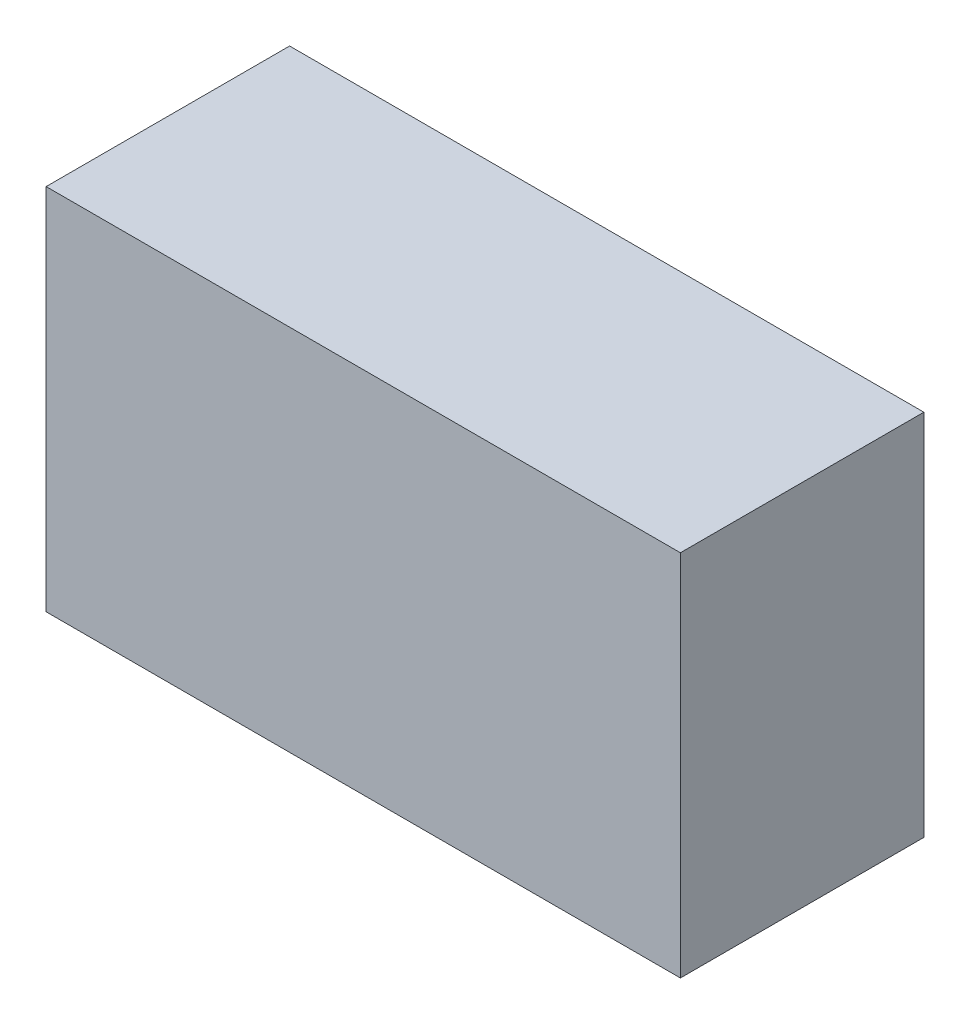
ISO-10303-21;
HEADER;
FILE_DESCRIPTION(('STEP AP214'),'2;1');
FILE_NAME('part.step','',(''),(''),'','','');
FILE_SCHEMA(('AUTOMOTIVE_DESIGN { 1 0 10303 214 1 1 1 1 }'));
ENDSEC;
DATA;
#1=APPLICATION_CONTEXT('core data for automotive mechanical design processes');
#2=APPLICATION_PROTOCOL_DEFINITION('international standard','automotive_design',2000,#1);
#3=PRODUCT_CONTEXT('',#1,'mechanical');
#4=PRODUCT('Part','Part','',(#3));
#5=PRODUCT_RELATED_PRODUCT_CATEGORY('part','',(#4));
#6=PRODUCT_DEFINITION_FORMATION('','',#4);
#7=PRODUCT_DEFINITION_CONTEXT('part definition',#1,'design');
#8=PRODUCT_DEFINITION('design','',#6,#7);
#9=PRODUCT_DEFINITION_SHAPE('','',#8);
#10=(LENGTH_UNIT() NAMED_UNIT(*) SI_UNIT(.MILLI.,.METRE.));
#11=(NAMED_UNIT(*) PLANE_ANGLE_UNIT() SI_UNIT($,.RADIAN.));
#12=(NAMED_UNIT(*) SI_UNIT($,.STERADIAN.) SOLID_ANGLE_UNIT());
#13=UNCERTAINTY_MEASURE_WITH_UNIT(LENGTH_MEASURE(1.E-05),#10,'distance_accuracy_value','');
#14=(GEOMETRIC_REPRESENTATION_CONTEXT(3) GLOBAL_UNCERTAINTY_ASSIGNED_CONTEXT((#13)) GLOBAL_UNIT_ASSIGNED_CONTEXT((#10,
#11,#12)) REPRESENTATION_CONTEXT('',''));
#15=CARTESIAN_POINT('',(0.,0.,0.));
#16=DIRECTION('',(0.,0.,1.));
#17=DIRECTION('',(1.,0.,0.));
#18=AXIS2_PLACEMENT_3D('',#15,#16,#17);
#19=CARTESIAN_POINT('',(-1.54999944,-0.90000074,1.19000016));
#20=DIRECTION('',(0.,0.,1.));
#21=DIRECTION('',(1.,0.,0.));
#22=AXIS2_PLACEMENT_3D('',#19,#20,#21);
#23=PLANE('',#22);
#24=DIRECTION('',(1.,0.,0.));
#25=VECTOR('',#24,1.);
#26=CARTESIAN_POINT('',(-1.54999944,0.90000074,1.19000016));
#27=LINE('',#26,#25);
#28=CARTESIAN_POINT('',(-1.54999944,0.90000074,1.19000016));
#29=VERTEX_POINT('',#28);
#30=CARTESIAN_POINT('',(1.54999944,0.90000074,1.19000016));
#31=VERTEX_POINT('',#30);
#32=EDGE_CURVE('E52',#29,#31,#27,.T.);
#33=ORIENTED_EDGE('',*,*,#32,.F.);
#34=DIRECTION('',(0.,1.,0.));
#35=VECTOR('',#34,1.);
#36=CARTESIAN_POINT('',(-1.54999944,-0.90000074,1.19000016));
#37=LINE('',#36,#35);
#38=CARTESIAN_POINT('',(-1.54999944,-0.90000074,1.19000016));
#39=VERTEX_POINT('',#38);
#40=EDGE_CURVE('E67',#39,#29,#37,.T.);
#41=ORIENTED_EDGE('',*,*,#40,.F.);
#42=DIRECTION('',(1.,0.,0.));
#43=VECTOR('',#42,1.);
#44=CARTESIAN_POINT('',(1.54999944,-0.90000074,1.19000016));
#45=LINE('',#44,#43);
#46=CARTESIAN_POINT('',(1.54999944,-0.90000074,1.19000016));
#47=VERTEX_POINT('',#46);
#48=EDGE_CURVE('E19',#47,#39,#45,.F.);
#49=ORIENTED_EDGE('',*,*,#48,.F.);
#50=DIRECTION('',(0.,1.,0.));
#51=VECTOR('',#50,1.);
#52=CARTESIAN_POINT('',(1.54999944,0.90000074,1.19000016));
#53=LINE('',#52,#51);
#54=EDGE_CURVE('E57',#31,#47,#53,.F.);
#55=ORIENTED_EDGE('',*,*,#54,.F.);
#56=EDGE_LOOP('',(#33,#41,#49,#55));
#57=FACE_BOUND('',#56,.T.);
#58=ADVANCED_FACE('F16',(#57),#23,.T.);
#59=CARTESIAN_POINT('',(1.54999944,-0.90000074,0.));
#60=DIRECTION('',(0.,-1.,0.));
#61=DIRECTION('',(0.,0.,-1.));
#62=AXIS2_PLACEMENT_3D('',#59,#60,#61);
#63=PLANE('',#62);
#64=DIRECTION('',(0.,0.,1.));
#65=VECTOR('',#64,1.);
#66=CARTESIAN_POINT('',(-1.54999944,-0.90000074,0.));
#67=LINE('',#66,#65);
#68=CARTESIAN_POINT('',(-1.54999944,-0.90000074,0.));
#69=VERTEX_POINT('',#68);
#70=EDGE_CURVE('E78',#69,#39,#67,.T.);
#71=ORIENTED_EDGE('',*,*,#70,.F.);
#72=DIRECTION('',(1.,0.,0.));
#73=VECTOR('',#72,1.);
#74=CARTESIAN_POINT('',(-1.54999944,-0.90000074,0.));
#75=LINE('',#74,#73);
#76=CARTESIAN_POINT('',(1.54999944,-0.90000074,0.));
#77=VERTEX_POINT('',#76);
#78=EDGE_CURVE('E73',#69,#77,#75,.T.);
#79=ORIENTED_EDGE('',*,*,#78,.T.);
#80=DIRECTION('',(0.,0.,-1.));
#81=VECTOR('',#80,1.);
#82=CARTESIAN_POINT('',(1.54999944,-0.90000074,0.));
#83=LINE('',#82,#81);
#84=EDGE_CURVE('E62',#47,#77,#83,.T.);
#85=ORIENTED_EDGE('',*,*,#84,.F.);
#86=ORIENTED_EDGE('',*,*,#48,.T.);
#87=EDGE_LOOP('',(#71,#79,#85,#86));
#88=FACE_BOUND('',#87,.T.);
#89=ADVANCED_FACE('F72',(#88),#63,.T.);
#90=CARTESIAN_POINT('',(1.54999944,0.90000074,0.));
#91=DIRECTION('',(1.,0.,0.));
#92=DIRECTION('',(0.,0.,-1.));
#93=AXIS2_PLACEMENT_3D('',#90,#91,#92);
#94=PLANE('',#93);
#95=ORIENTED_EDGE('',*,*,#84,.T.);
#96=DIRECTION('',(0.,1.,0.));
#97=VECTOR('',#96,1.);
#98=CARTESIAN_POINT('',(1.54999944,-0.90000074,0.));
#99=LINE('',#98,#97);
#100=CARTESIAN_POINT('',(1.54999944,0.90000074,0.));
#101=VERTEX_POINT('',#100);
#102=EDGE_CURVE('E83',#77,#101,#99,.T.);
#103=ORIENTED_EDGE('',*,*,#102,.T.);
#104=DIRECTION('',(0.,0.,1.));
#105=VECTOR('',#104,1.);
#106=CARTESIAN_POINT('',(1.54999944,0.90000074,0.));
#107=LINE('',#106,#105);
#108=EDGE_CURVE('E64',#31,#101,#107,.F.);
#109=ORIENTED_EDGE('',*,*,#108,.F.);
#110=ORIENTED_EDGE('',*,*,#54,.T.);
#111=EDGE_LOOP('',(#95,#103,#109,#110));
#112=FACE_BOUND('',#111,.T.);
#113=ADVANCED_FACE('F59',(#112),#94,.T.);
#114=CARTESIAN_POINT('',(-1.54999944,0.90000074,0.));
#115=DIRECTION('',(0.,1.,0.));
#116=DIRECTION('',(0.,0.,1.));
#117=AXIS2_PLACEMENT_3D('',#114,#115,#116);
#118=PLANE('',#117);
#119=ORIENTED_EDGE('',*,*,#108,.T.);
#120=DIRECTION('',(1.,0.,0.));
#121=VECTOR('',#120,1.);
#122=CARTESIAN_POINT('',(-1.54999944,0.90000074,0.));
#123=LINE('',#122,#121);
#124=CARTESIAN_POINT('',(-1.54999944,0.90000074,0.));
#125=VERTEX_POINT('',#124);
#126=EDGE_CURVE('E25',#101,#125,#123,.F.);
#127=ORIENTED_EDGE('',*,*,#126,.T.);
#128=DIRECTION('',(0.,0.,1.));
#129=VECTOR('',#128,1.);
#130=CARTESIAN_POINT('',(-1.54999944,0.90000074,0.));
#131=LINE('',#130,#129);
#132=EDGE_CURVE('E33',#29,#125,#131,.F.);
#133=ORIENTED_EDGE('',*,*,#132,.F.);
#134=ORIENTED_EDGE('',*,*,#32,.T.);
#135=EDGE_LOOP('',(#119,#127,#133,#134));
#136=FACE_BOUND('',#135,.T.);
#137=ADVANCED_FACE('F87',(#136),#118,.T.);
#138=CARTESIAN_POINT('',(-1.54999944,-0.90000074,0.));
#139=DIRECTION('',(-1.,0.,0.));
#140=DIRECTION('',(0.,0.,1.));
#141=AXIS2_PLACEMENT_3D('',#138,#139,#140);
#142=PLANE('',#141);
#143=ORIENTED_EDGE('',*,*,#132,.T.);
#144=DIRECTION('',(0.,1.,0.));
#145=VECTOR('',#144,1.);
#146=CARTESIAN_POINT('',(-1.54999944,-0.90000074,0.));
#147=LINE('',#146,#145);
#148=EDGE_CURVE('E11',#125,#69,#147,.F.);
#149=ORIENTED_EDGE('',*,*,#148,.T.);
#150=ORIENTED_EDGE('',*,*,#70,.T.);
#151=ORIENTED_EDGE('',*,*,#40,.T.);
#152=EDGE_LOOP('',(#143,#149,#150,#151));
#153=FACE_BOUND('',#152,.T.);
#154=ADVANCED_FACE('F90',(#153),#142,.T.);
#155=CARTESIAN_POINT('',(-1.54999944,-0.90000074,0.));
#156=DIRECTION('',(0.,0.,1.));
#157=DIRECTION('',(1.,0.,0.));
#158=AXIS2_PLACEMENT_3D('',#155,#156,#157);
#159=PLANE('',#158);
#160=ORIENTED_EDGE('',*,*,#126,.F.);
#161=ORIENTED_EDGE('',*,*,#102,.F.);
#162=ORIENTED_EDGE('',*,*,#78,.F.);
#163=ORIENTED_EDGE('',*,*,#148,.F.);
#164=EDGE_LOOP('',(#160,#161,#162,#163));
#165=FACE_BOUND('',#164,.T.);
#166=ADVANCED_FACE('F89',(#165),#159,.F.);
#167=CLOSED_SHELL('',(#58,#89,#113,#137,#154,#166));
#168=MANIFOLD_SOLID_BREP('B1',#167);
#169=ADVANCED_BREP_SHAPE_REPRESENTATION('',(#18,#168),#14);
#170=SHAPE_DEFINITION_REPRESENTATION(#9,#169);
ENDSEC;
END-ISO-10303-21;
